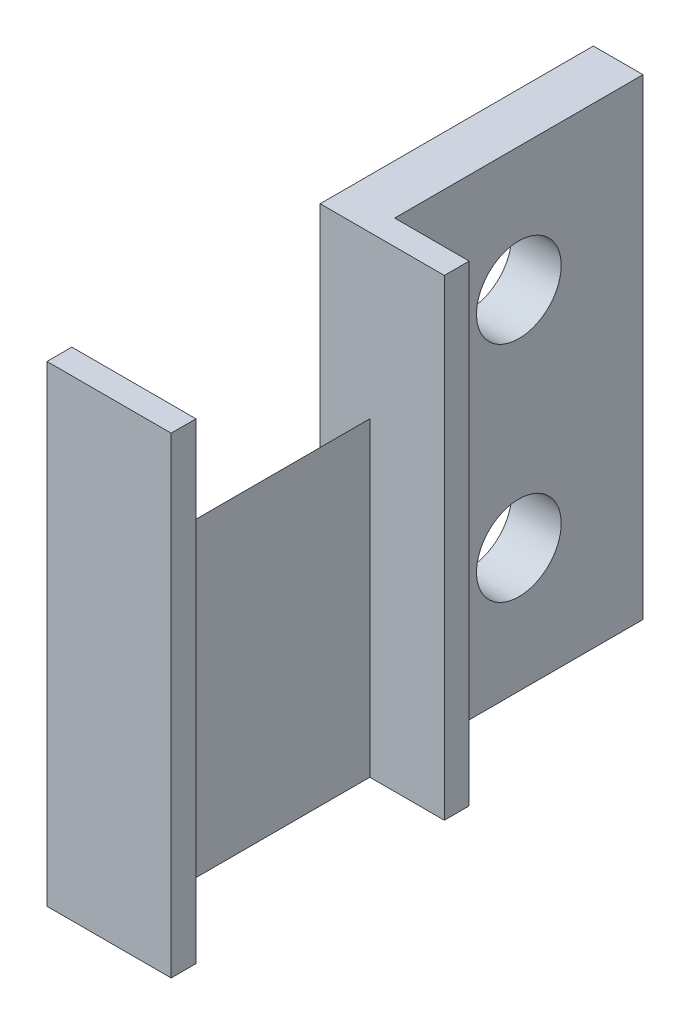
ISO-10303-21;
HEADER;
FILE_DESCRIPTION(('STEP AP214'),'2;1');
FILE_NAME('part.step','',(''),(''),'','','');
FILE_SCHEMA(('AUTOMOTIVE_DESIGN { 1 0 10303 214 1 1 1 1 }'));
ENDSEC;
DATA;
#1=APPLICATION_CONTEXT('core data for automotive mechanical design processes');
#2=APPLICATION_PROTOCOL_DEFINITION('international standard','automotive_design',2000,#1);
#3=PRODUCT_CONTEXT('',#1,'mechanical');
#4=PRODUCT('Part','Part','',(#3));
#5=PRODUCT_RELATED_PRODUCT_CATEGORY('part','',(#4));
#6=PRODUCT_DEFINITION_FORMATION('','',#4);
#7=PRODUCT_DEFINITION_CONTEXT('part definition',#1,'design');
#8=PRODUCT_DEFINITION('design','',#6,#7);
#9=PRODUCT_DEFINITION_SHAPE('','',#8);
#10=(LENGTH_UNIT() NAMED_UNIT(*) SI_UNIT(.MILLI.,.METRE.));
#11=(NAMED_UNIT(*) PLANE_ANGLE_UNIT() SI_UNIT($,.RADIAN.));
#12=(NAMED_UNIT(*) SI_UNIT($,.STERADIAN.) SOLID_ANGLE_UNIT());
#13=UNCERTAINTY_MEASURE_WITH_UNIT(LENGTH_MEASURE(1.E-05),#10,'distance_accuracy_value','');
#14=(GEOMETRIC_REPRESENTATION_CONTEXT(3) GLOBAL_UNCERTAINTY_ASSIGNED_CONTEXT((#13)) GLOBAL_UNIT_ASSIGNED_CONTEXT((#10,
#11,#12)) REPRESENTATION_CONTEXT('',''));
#15=CARTESIAN_POINT('',(0.,0.,0.));
#16=DIRECTION('',(0.,0.,1.));
#17=DIRECTION('',(1.,0.,0.));
#18=AXIS2_PLACEMENT_3D('',#15,#16,#17);
#19=CARTESIAN_POINT('',(-2.,-12.5,10.));
#20=DIRECTION('',(1.,0.,0.));
#21=DIRECTION('',(0.,0.,-1.));
#22=AXIS2_PLACEMENT_3D('',#19,#20,#21);
#23=PLANE('',#22);
#24=CARTESIAN_POINT('',(-2.,-2.5,-22.));
#25=DIRECTION('',(1.,0.,0.));
#26=DIRECTION('',(0.,0.,-1.));
#27=AXIS2_PLACEMENT_3D('',#24,#25,#26);
#28=CIRCLE('',#27,3.41);
#29=CARTESIAN_POINT('',(-2.,-2.5,-25.41));
#30=VERTEX_POINT('',#29);
#31=EDGE_CURVE('E171',#30,#30,#28,.F.);
#32=ORIENTED_EDGE('',*,*,#31,.F.);
#33=EDGE_LOOP('',(#32));
#34=FACE_BOUND('',#33,.T.);
#35=CARTESIAN_POINT('',(-2.,15.5,-22.));
#36=DIRECTION('',(1.,0.,0.));
#37=DIRECTION('',(0.,0.,-1.));
#38=AXIS2_PLACEMENT_3D('',#35,#36,#37);
#39=CIRCLE('',#38,3.41);
#40=CARTESIAN_POINT('',(-2.,15.5,-25.41));
#41=VERTEX_POINT('',#40);
#42=EDGE_CURVE('E174',#41,#41,#39,.F.);
#43=ORIENTED_EDGE('',*,*,#42,.F.);
#44=EDGE_LOOP('',(#43));
#45=FACE_BOUND('',#44,.T.);
#46=DIRECTION('',(0.,0.,-1.));
#47=VECTOR('',#46,1.);
#48=CARTESIAN_POINT('',(-2.,5.,10.));
#49=LINE('',#48,#47);
#50=CARTESIAN_POINT('',(-1.99999999999998,5.00000000000004,10.));
#51=VERTEX_POINT('',#50);
#52=CARTESIAN_POINT('',(-1.99999999999999,5.00000000000004,-10.));
#53=VERTEX_POINT('',#52);
#54=EDGE_CURVE('E86',#51,#53,#49,.T.);
#55=ORIENTED_EDGE('',*,*,#54,.T.);
#56=DIRECTION('',(0.,-1.,0.));
#57=VECTOR('',#56,1.);
#58=CARTESIAN_POINT('',(-1.99999999999998,25.5,-10.));
#59=LINE('',#58,#57);
#60=CARTESIAN_POINT('',(-1.99999999999998,25.5,-10.));
#61=VERTEX_POINT('',#60);
#62=EDGE_CURVE('E146',#61,#53,#59,.T.);
#63=ORIENTED_EDGE('',*,*,#62,.F.);
#64=DIRECTION('',(0.,0.,-1.));
#65=VECTOR('',#64,1.);
#66=CARTESIAN_POINT('',(-1.99999999999998,25.5,-10.));
#67=LINE('',#66,#65);
#68=CARTESIAN_POINT('',(-1.99999999999998,25.5,-32.));
#69=VERTEX_POINT('',#68);
#70=EDGE_CURVE('E142',#61,#69,#67,.T.);
#71=ORIENTED_EDGE('',*,*,#70,.T.);
#72=DIRECTION('',(0.,1.,0.));
#73=VECTOR('',#72,1.);
#74=CARTESIAN_POINT('',(-2.,-12.5,-32.));
#75=LINE('',#74,#73);
#76=CARTESIAN_POINT('',(-2.,-12.5,-32.));
#77=VERTEX_POINT('',#76);
#78=EDGE_CURVE('E145',#77,#69,#75,.T.);
#79=ORIENTED_EDGE('',*,*,#78,.F.);
#80=DIRECTION('',(0.,0.,-1.));
#81=VECTOR('',#80,1.);
#82=CARTESIAN_POINT('',(-2.,-12.5,10.));
#83=LINE('',#82,#81);
#84=CARTESIAN_POINT('',(-2.,-12.5,12.));
#85=VERTEX_POINT('',#84);
#86=EDGE_CURVE('E11',#85,#77,#83,.T.);
#87=ORIENTED_EDGE('',*,*,#86,.F.);
#88=DIRECTION('',(0.,-1.,0.));
#89=VECTOR('',#88,1.);
#90=CARTESIAN_POINT('',(-1.99999999999998,25.5,12.));
#91=LINE('',#90,#89);
#92=CARTESIAN_POINT('',(-1.99999999999998,25.5,12.));
#93=VERTEX_POINT('',#92);
#94=EDGE_CURVE('E243',#93,#85,#91,.T.);
#95=ORIENTED_EDGE('',*,*,#94,.F.);
#96=DIRECTION('',(0.,0.,-1.));
#97=VECTOR('',#96,1.);
#98=CARTESIAN_POINT('',(-1.99999999999998,25.5,10.));
#99=LINE('',#98,#97);
#100=CARTESIAN_POINT('',(-1.99999999999998,25.5,10.));
#101=VERTEX_POINT('',#100);
#102=EDGE_CURVE('E216',#93,#101,#99,.T.);
#103=ORIENTED_EDGE('',*,*,#102,.T.);
#104=DIRECTION('',(0.,-1.,0.));
#105=VECTOR('',#104,1.);
#106=CARTESIAN_POINT('',(-1.99999999999998,25.5,10.));
#107=LINE('',#106,#105);
#108=EDGE_CURVE('E233',#101,#51,#107,.T.);
#109=ORIENTED_EDGE('',*,*,#108,.T.);
#110=EDGE_LOOP('',(#55,#63,#71,#79,#87,#95,#103,#109));
#111=FACE_BOUND('',#110,.T.);
#112=ADVANCED_FACE('F45',(#34,#45,#111),#23,.F.);
#113=CARTESIAN_POINT('',(2.,-12.5,10.));
#114=DIRECTION('',(0.,1.,0.));
#115=DIRECTION('',(0.,0.,1.));
#116=AXIS2_PLACEMENT_3D('',#113,#114,#115);
#117=PLANE('',#116);
#118=ORIENTED_EDGE('',*,*,#86,.T.);
#119=DIRECTION('',(-1.,0.,0.));
#120=VECTOR('',#119,1.);
#121=CARTESIAN_POINT('',(-2.,-12.5,-32.));
#122=LINE('',#121,#120);
#123=CARTESIAN_POINT('',(2.00000000000002,-12.5,-32.));
#124=VERTEX_POINT('',#123);
#125=EDGE_CURVE('E167',#124,#77,#122,.T.);
#126=ORIENTED_EDGE('',*,*,#125,.F.);
#127=DIRECTION('',(0.,0.,1.));
#128=VECTOR('',#127,1.);
#129=CARTESIAN_POINT('',(2.00000000000002,-12.5,-32.));
#130=LINE('',#129,#128);
#131=CARTESIAN_POINT('',(2.00000000000002,-12.5,-12.));
#132=VERTEX_POINT('',#131);
#133=EDGE_CURVE('E180',#124,#132,#130,.T.);
#134=ORIENTED_EDGE('',*,*,#133,.T.);
#135=DIRECTION('',(1.,0.,0.));
#136=VECTOR('',#135,1.);
#137=CARTESIAN_POINT('',(-2.,-12.5,-12.));
#138=LINE('',#137,#136);
#139=CARTESIAN_POINT('',(8.,-12.5,-12.));
#140=VERTEX_POINT('',#139);
#141=EDGE_CURVE('E200',#132,#140,#138,.T.);
#142=ORIENTED_EDGE('',*,*,#141,.T.);
#143=DIRECTION('',(0.,0.,1.));
#144=VECTOR('',#143,1.);
#145=CARTESIAN_POINT('',(8.,-12.5,-10.));
#146=LINE('',#145,#144);
#147=CARTESIAN_POINT('',(8.,-12.5,-10.));
#148=VERTEX_POINT('',#147);
#149=EDGE_CURVE('E189',#140,#148,#146,.T.);
#150=ORIENTED_EDGE('',*,*,#149,.T.);
#151=DIRECTION('',(-1.,0.,0.));
#152=VECTOR('',#151,1.);
#153=CARTESIAN_POINT('',(-2.,-12.5,-10.));
#154=LINE('',#153,#152);
#155=CARTESIAN_POINT('',(2.,-12.5,-10.));
#156=VERTEX_POINT('',#155);
#157=EDGE_CURVE('E187',#148,#156,#154,.T.);
#158=ORIENTED_EDGE('',*,*,#157,.T.);
#159=DIRECTION('',(0.,0.,-1.));
#160=VECTOR('',#159,1.);
#161=CARTESIAN_POINT('',(2.,-12.5,10.));
#162=LINE('',#161,#160);
#163=CARTESIAN_POINT('',(2.,-12.5,10.));
#164=VERTEX_POINT('',#163);
#165=EDGE_CURVE('E53',#164,#156,#162,.T.);
#166=ORIENTED_EDGE('',*,*,#165,.F.);
#167=DIRECTION('',(1.,0.,0.));
#168=VECTOR('',#167,1.);
#169=CARTESIAN_POINT('',(-2.,-12.5,10.));
#170=LINE('',#169,#168);
#171=CARTESIAN_POINT('',(8.,-12.5,10.));
#172=VERTEX_POINT('',#171);
#173=EDGE_CURVE('E209',#164,#172,#170,.T.);
#174=ORIENTED_EDGE('',*,*,#173,.T.);
#175=DIRECTION('',(0.,0.,1.));
#176=VECTOR('',#175,1.);
#177=CARTESIAN_POINT('',(8.,-12.5,10.));
#178=LINE('',#177,#176);
#179=CARTESIAN_POINT('',(8.,-12.5,12.));
#180=VERTEX_POINT('',#179);
#181=EDGE_CURVE('E236',#172,#180,#178,.T.);
#182=ORIENTED_EDGE('',*,*,#181,.T.);
#183=DIRECTION('',(-1.,0.,0.));
#184=VECTOR('',#183,1.);
#185=CARTESIAN_POINT('',(-2.,-12.5,12.));
#186=LINE('',#185,#184);
#187=EDGE_CURVE('E221',#180,#85,#186,.T.);
#188=ORIENTED_EDGE('',*,*,#187,.T.);
#189=EDGE_LOOP('',(#118,#126,#134,#142,#150,#158,#166,#174,#182,#188));
#190=FACE_BOUND('',#189,.T.);
#191=ADVANCED_FACE('F277',(#190),#117,.F.);
#192=CARTESIAN_POINT('',(2.,12.5,10.));
#193=DIRECTION('',(-1.,0.,0.));
#194=DIRECTION('',(0.,0.,1.));
#195=AXIS2_PLACEMENT_3D('',#192,#193,#194);
#196=PLANE('',#195);
#197=DIRECTION('',(0.,1.,0.));
#198=VECTOR('',#197,1.);
#199=CARTESIAN_POINT('',(2.,12.5,-10.));
#200=LINE('',#199,#198);
#201=CARTESIAN_POINT('',(2.,12.5,-10.));
#202=VERTEX_POINT('',#201);
#203=EDGE_CURVE('E247',#156,#202,#200,.T.);
#204=ORIENTED_EDGE('',*,*,#203,.T.);
#205=DIRECTION('',(0.,0.,-1.));
#206=VECTOR('',#205,1.);
#207=CARTESIAN_POINT('',(2.,12.5,10.));
#208=LINE('',#207,#206);
#209=CARTESIAN_POINT('',(2.,12.5,10.));
#210=VERTEX_POINT('',#209);
#211=EDGE_CURVE('E69',#210,#202,#208,.T.);
#212=ORIENTED_EDGE('',*,*,#211,.F.);
#213=DIRECTION('',(0.,1.,0.));
#214=VECTOR('',#213,1.);
#215=CARTESIAN_POINT('',(2.,12.5,10.));
#216=LINE('',#215,#214);
#217=EDGE_CURVE('E258',#164,#210,#216,.T.);
#218=ORIENTED_EDGE('',*,*,#217,.F.);
#219=ORIENTED_EDGE('',*,*,#165,.T.);
#220=EDGE_LOOP('',(#204,#212,#218,#219));
#221=FACE_BOUND('',#220,.T.);
#222=ADVANCED_FACE('F274',(#221),#196,.F.);
#223=CARTESIAN_POINT('',(-2.,5.,10.));
#224=DIRECTION('',(0.882352941176471,-0.470588235294118,0.));
#225=DIRECTION('',(0.470588235294118,0.882352941176471,0.));
#226=AXIS2_PLACEMENT_3D('',#223,#224,#225);
#227=PLANE('',#226);
#228=DIRECTION('',(-0.470588235294118,-0.882352941176471,0.));
#229=VECTOR('',#228,1.);
#230=CARTESIAN_POINT('',(-2.,5.,-10.));
#231=LINE('',#230,#229);
#232=EDGE_CURVE('E81',#202,#53,#231,.T.);
#233=ORIENTED_EDGE('',*,*,#232,.T.);
#234=ORIENTED_EDGE('',*,*,#54,.F.);
#235=DIRECTION('',(-0.470588235294118,-0.882352941176471,0.));
#236=VECTOR('',#235,1.);
#237=CARTESIAN_POINT('',(-2.,5.,10.));
#238=LINE('',#237,#236);
#239=EDGE_CURVE('E262',#210,#51,#238,.T.);
#240=ORIENTED_EDGE('',*,*,#239,.F.);
#241=ORIENTED_EDGE('',*,*,#211,.T.);
#242=EDGE_LOOP('',(#233,#234,#240,#241));
#243=FACE_BOUND('',#242,.T.);
#244=ADVANCED_FACE('F300',(#243),#227,.F.);
#245=CARTESIAN_POINT('',(-1.99999999999998,25.5,12.));
#246=DIRECTION('',(0.,0.,1.));
#247=DIRECTION('',(1.,0.,0.));
#248=AXIS2_PLACEMENT_3D('',#245,#246,#247);
#249=PLANE('',#248);
#250=ORIENTED_EDGE('',*,*,#187,.F.);
#251=DIRECTION('',(0.,-1.,0.));
#252=VECTOR('',#251,1.);
#253=CARTESIAN_POINT('',(8.00000000000002,25.5,12.));
#254=LINE('',#253,#252);
#255=CARTESIAN_POINT('',(8.00000000000002,25.5,12.));
#256=VERTEX_POINT('',#255);
#257=EDGE_CURVE('E248',#256,#180,#254,.T.);
#258=ORIENTED_EDGE('',*,*,#257,.F.);
#259=DIRECTION('',(-1.,0.,0.));
#260=VECTOR('',#259,1.);
#261=CARTESIAN_POINT('',(-1.99999999999998,25.5,12.));
#262=LINE('',#261,#260);
#263=EDGE_CURVE('E229',#256,#93,#262,.T.);
#264=ORIENTED_EDGE('',*,*,#263,.T.);
#265=ORIENTED_EDGE('',*,*,#94,.T.);
#266=EDGE_LOOP('',(#250,#258,#264,#265));
#267=FACE_BOUND('',#266,.T.);
#268=ADVANCED_FACE('F292',(#267),#249,.T.);
#269=CARTESIAN_POINT('',(8.00000000000002,25.5,10.));
#270=DIRECTION('',(1.,0.,0.));
#271=DIRECTION('',(0.,1.,0.));
#272=AXIS2_PLACEMENT_3D('',#269,#270,#271);
#273=PLANE('',#272);
#274=ORIENTED_EDGE('',*,*,#181,.F.);
#275=DIRECTION('',(0.,-1.,0.));
#276=VECTOR('',#275,1.);
#277=CARTESIAN_POINT('',(8.00000000000002,25.5,10.));
#278=LINE('',#277,#276);
#279=CARTESIAN_POINT('',(8.00000000000002,25.5,10.));
#280=VERTEX_POINT('',#279);
#281=EDGE_CURVE('E251',#280,#172,#278,.T.);
#282=ORIENTED_EDGE('',*,*,#281,.F.);
#283=DIRECTION('',(0.,0.,1.));
#284=VECTOR('',#283,1.);
#285=CARTESIAN_POINT('',(8.00000000000002,25.5,10.));
#286=LINE('',#285,#284);
#287=EDGE_CURVE('E225',#280,#256,#286,.T.);
#288=ORIENTED_EDGE('',*,*,#287,.T.);
#289=ORIENTED_EDGE('',*,*,#257,.T.);
#290=EDGE_LOOP('',(#274,#282,#288,#289));
#291=FACE_BOUND('',#290,.T.);
#292=ADVANCED_FACE('F307',(#291),#273,.T.);
#293=CARTESIAN_POINT('',(-1.99999999999998,25.5,10.));
#294=DIRECTION('',(0.,0.,-1.));
#295=DIRECTION('',(-1.,0.,0.));
#296=AXIS2_PLACEMENT_3D('',#293,#294,#295);
#297=PLANE('',#296);
#298=ORIENTED_EDGE('',*,*,#173,.F.);
#299=ORIENTED_EDGE('',*,*,#217,.T.);
#300=ORIENTED_EDGE('',*,*,#239,.T.);
#301=ORIENTED_EDGE('',*,*,#108,.F.);
#302=DIRECTION('',(1.,0.,0.));
#303=VECTOR('',#302,1.);
#304=CARTESIAN_POINT('',(-1.99999999999998,25.5,10.));
#305=LINE('',#304,#303);
#306=EDGE_CURVE('E220',#101,#280,#305,.T.);
#307=ORIENTED_EDGE('',*,*,#306,.T.);
#308=ORIENTED_EDGE('',*,*,#281,.T.);
#309=EDGE_LOOP('',(#298,#299,#300,#301,#307,#308));
#310=FACE_BOUND('',#309,.T.);
#311=ADVANCED_FACE('F299',(#310),#297,.T.);
#312=CARTESIAN_POINT('',(0.,25.5,0.));
#313=DIRECTION('',(0.,1.,0.));
#314=DIRECTION('',(-1.,0.,0.));
#315=AXIS2_PLACEMENT_3D('',#312,#313,#314);
#316=PLANE('',#315);
#317=ORIENTED_EDGE('',*,*,#102,.F.);
#318=ORIENTED_EDGE('',*,*,#263,.F.);
#319=ORIENTED_EDGE('',*,*,#287,.F.);
#320=ORIENTED_EDGE('',*,*,#306,.F.);
#321=EDGE_LOOP('',(#317,#318,#319,#320));
#322=FACE_BOUND('',#321,.T.);
#323=ADVANCED_FACE('F296',(#322),#316,.T.);
#324=CARTESIAN_POINT('',(-1.99999999999998,25.5,-10.));
#325=DIRECTION('',(0.,0.,1.));
#326=DIRECTION('',(1.,0.,0.));
#327=AXIS2_PLACEMENT_3D('',#324,#325,#326);
#328=PLANE('',#327);
#329=ORIENTED_EDGE('',*,*,#232,.F.);
#330=ORIENTED_EDGE('',*,*,#203,.F.);
#331=ORIENTED_EDGE('',*,*,#157,.F.);
#332=DIRECTION('',(0.,-1.,0.));
#333=VECTOR('',#332,1.);
#334=CARTESIAN_POINT('',(8.00000000000002,25.5,-10.));
#335=LINE('',#334,#333);
#336=CARTESIAN_POINT('',(8.00000000000002,25.5,-10.));
#337=VERTEX_POINT('',#336);
#338=EDGE_CURVE('E206',#337,#148,#335,.T.);
#339=ORIENTED_EDGE('',*,*,#338,.F.);
#340=DIRECTION('',(-1.,0.,0.));
#341=VECTOR('',#340,1.);
#342=CARTESIAN_POINT('',(-1.99999999999998,25.5,-10.));
#343=LINE('',#342,#341);
#344=EDGE_CURVE('E152',#337,#61,#343,.T.);
#345=ORIENTED_EDGE('',*,*,#344,.T.);
#346=ORIENTED_EDGE('',*,*,#62,.T.);
#347=EDGE_LOOP('',(#329,#330,#331,#339,#345,#346));
#348=FACE_BOUND('',#347,.T.);
#349=ADVANCED_FACE('F280',(#348),#328,.T.);
#350=CARTESIAN_POINT('',(8.00000000000002,25.5,-10.));
#351=DIRECTION('',(1.,0.,0.));
#352=DIRECTION('',(0.,1.,0.));
#353=AXIS2_PLACEMENT_3D('',#350,#351,#352);
#354=PLANE('',#353);
#355=ORIENTED_EDGE('',*,*,#149,.F.);
#356=DIRECTION('',(0.,-1.,0.));
#357=VECTOR('',#356,1.);
#358=CARTESIAN_POINT('',(8.00000000000002,25.5,-12.));
#359=LINE('',#358,#357);
#360=CARTESIAN_POINT('',(8.00000000000002,25.5,-12.));
#361=VERTEX_POINT('',#360);
#362=EDGE_CURVE('E210',#361,#140,#359,.T.);
#363=ORIENTED_EDGE('',*,*,#362,.F.);
#364=DIRECTION('',(0.,0.,1.));
#365=VECTOR('',#364,1.);
#366=CARTESIAN_POINT('',(8.00000000000002,25.5,-10.));
#367=LINE('',#366,#365);
#368=EDGE_CURVE('E193',#361,#337,#367,.T.);
#369=ORIENTED_EDGE('',*,*,#368,.T.);
#370=ORIENTED_EDGE('',*,*,#338,.T.);
#371=EDGE_LOOP('',(#355,#363,#369,#370));
#372=FACE_BOUND('',#371,.T.);
#373=ADVANCED_FACE('F284',(#372),#354,.T.);
#374=CARTESIAN_POINT('',(-1.99999999999998,25.5,-12.));
#375=DIRECTION('',(0.,0.,-1.));
#376=DIRECTION('',(-1.,0.,0.));
#377=AXIS2_PLACEMENT_3D('',#374,#375,#376);
#378=PLANE('',#377);
#379=DIRECTION('',(0.,-1.,0.));
#380=VECTOR('',#379,1.);
#381=CARTESIAN_POINT('',(2.00000000000002,-12.5,-12.));
#382=LINE('',#381,#380);
#383=CARTESIAN_POINT('',(2.00000000000002,25.5,-12.));
#384=VERTEX_POINT('',#383);
#385=EDGE_CURVE('E60',#384,#132,#382,.T.);
#386=ORIENTED_EDGE('',*,*,#385,.F.);
#387=DIRECTION('',(1.,0.,0.));
#388=VECTOR('',#387,1.);
#389=CARTESIAN_POINT('',(-1.99999999999998,25.5,-12.));
#390=LINE('',#389,#388);
#391=EDGE_CURVE('E151',#384,#361,#390,.T.);
#392=ORIENTED_EDGE('',*,*,#391,.T.);
#393=ORIENTED_EDGE('',*,*,#362,.T.);
#394=ORIENTED_EDGE('',*,*,#141,.F.);
#395=EDGE_LOOP('',(#386,#392,#393,#394));
#396=FACE_BOUND('',#395,.T.);
#397=ADVANCED_FACE('F285',(#396),#378,.T.);
#398=CARTESIAN_POINT('',(0.,25.5,0.));
#399=DIRECTION('',(0.,1.,0.));
#400=DIRECTION('',(-1.,0.,0.));
#401=AXIS2_PLACEMENT_3D('',#398,#399,#400);
#402=PLANE('',#401);
#403=ORIENTED_EDGE('',*,*,#344,.F.);
#404=ORIENTED_EDGE('',*,*,#368,.F.);
#405=ORIENTED_EDGE('',*,*,#391,.F.);
#406=DIRECTION('',(0.,0.,1.));
#407=VECTOR('',#406,1.);
#408=CARTESIAN_POINT('',(2.00000000000002,25.5,-32.));
#409=LINE('',#408,#407);
#410=CARTESIAN_POINT('',(2.00000000000002,25.5,-32.));
#411=VERTEX_POINT('',#410);
#412=EDGE_CURVE('E158',#411,#384,#409,.T.);
#413=ORIENTED_EDGE('',*,*,#412,.F.);
#414=DIRECTION('',(1.,0.,0.));
#415=VECTOR('',#414,1.);
#416=CARTESIAN_POINT('',(-1.99999999999998,25.5,-32.));
#417=LINE('',#416,#415);
#418=EDGE_CURVE('E155',#69,#411,#417,.T.);
#419=ORIENTED_EDGE('',*,*,#418,.F.);
#420=ORIENTED_EDGE('',*,*,#70,.F.);
#421=EDGE_LOOP('',(#403,#404,#405,#413,#419,#420));
#422=FACE_BOUND('',#421,.T.);
#423=ADVANCED_FACE('F156',(#422),#402,.T.);
#424=CARTESIAN_POINT('',(2.00000000000002,-12.5,-32.));
#425=DIRECTION('',(-1.,0.,0.));
#426=DIRECTION('',(0.,-1.,0.));
#427=AXIS2_PLACEMENT_3D('',#424,#425,#426);
#428=PLANE('',#427);
#429=CARTESIAN_POINT('',(2.,-2.5,-22.));
#430=DIRECTION('',(1.,0.,0.));
#431=DIRECTION('',(0.,0.,-1.));
#432=AXIS2_PLACEMENT_3D('',#429,#430,#431);
#433=CIRCLE('',#432,3.41);
#434=CARTESIAN_POINT('',(2.,-2.5,-25.41));
#435=VERTEX_POINT('',#434);
#436=EDGE_CURVE('E325',#435,#435,#433,.T.);
#437=ORIENTED_EDGE('',*,*,#436,.F.);
#438=EDGE_LOOP('',(#437));
#439=FACE_BOUND('',#438,.T.);
#440=CARTESIAN_POINT('',(2.,15.5,-22.));
#441=DIRECTION('',(1.,0.,0.));
#442=DIRECTION('',(0.,0.,-1.));
#443=AXIS2_PLACEMENT_3D('',#440,#441,#442);
#444=CIRCLE('',#443,3.41);
#445=CARTESIAN_POINT('',(2.,15.5,-25.41));
#446=VERTEX_POINT('',#445);
#447=EDGE_CURVE('E326',#446,#446,#444,.T.);
#448=ORIENTED_EDGE('',*,*,#447,.F.);
#449=EDGE_LOOP('',(#448));
#450=FACE_BOUND('',#449,.T.);
#451=ORIENTED_EDGE('',*,*,#385,.T.);
#452=ORIENTED_EDGE('',*,*,#133,.F.);
#453=DIRECTION('',(0.,-1.,0.));
#454=VECTOR('',#453,1.);
#455=CARTESIAN_POINT('',(2.00000000000002,-12.5,-32.));
#456=LINE('',#455,#454);
#457=EDGE_CURVE('E162',#411,#124,#456,.T.);
#458=ORIENTED_EDGE('',*,*,#457,.F.);
#459=ORIENTED_EDGE('',*,*,#412,.T.);
#460=EDGE_LOOP('',(#451,#452,#458,#459));
#461=FACE_BOUND('',#460,.T.);
#462=ADVANCED_FACE('F287',(#439,#450,#461),#428,.F.);
#463=CARTESIAN_POINT('',(0.,0.,-32.));
#464=DIRECTION('',(0.,0.,-1.));
#465=DIRECTION('',(-1.,0.,0.));
#466=AXIS2_PLACEMENT_3D('',#463,#464,#465);
#467=PLANE('',#466);
#468=ORIENTED_EDGE('',*,*,#78,.T.);
#469=ORIENTED_EDGE('',*,*,#418,.T.);
#470=ORIENTED_EDGE('',*,*,#457,.T.);
#471=ORIENTED_EDGE('',*,*,#125,.T.);
#472=EDGE_LOOP('',(#468,#469,#470,#471));
#473=FACE_BOUND('',#472,.T.);
#474=ADVANCED_FACE('F165',(#473),#467,.T.);
#475=CARTESIAN_POINT('',(-2.001,15.5,-22.));
#476=DIRECTION('',(1.,0.,0.));
#477=DIRECTION('',(0.,0.,-1.));
#478=AXIS2_PLACEMENT_3D('',#475,#476,#477);
#479=CYLINDRICAL_SURFACE('',#478,3.41);
#480=ORIENTED_EDGE('',*,*,#447,.T.);
#481=EDGE_LOOP('',(#480));
#482=FACE_BOUND('',#481,.T.);
#483=ORIENTED_EDGE('',*,*,#42,.T.);
#484=EDGE_LOOP('',(#483));
#485=FACE_BOUND('',#484,.T.);
#486=ADVANCED_FACE('F339',(#482,#485),#479,.F.);
#487=CARTESIAN_POINT('',(-2.001,-2.5,-22.));
#488=DIRECTION('',(1.,0.,0.));
#489=DIRECTION('',(0.,0.,-1.));
#490=AXIS2_PLACEMENT_3D('',#487,#488,#489);
#491=CYLINDRICAL_SURFACE('',#490,3.41);
#492=ORIENTED_EDGE('',*,*,#436,.T.);
#493=EDGE_LOOP('',(#492));
#494=FACE_BOUND('',#493,.T.);
#495=ORIENTED_EDGE('',*,*,#31,.T.);
#496=EDGE_LOOP('',(#495));
#497=FACE_BOUND('',#496,.T.);
#498=ADVANCED_FACE('F337',(#494,#497),#491,.F.);
#499=CLOSED_SHELL('',(#112,#191,#222,#244,#268,#292,#311,#323,#349,#373,#397,#423,#462,#474,
#486,#498));
#500=MANIFOLD_SOLID_BREP('B2',#499);
#501=ADVANCED_BREP_SHAPE_REPRESENTATION('',(#18,#500),#14);
#502=SHAPE_DEFINITION_REPRESENTATION(#9,#501);
ENDSEC;
END-ISO-10303-21;
